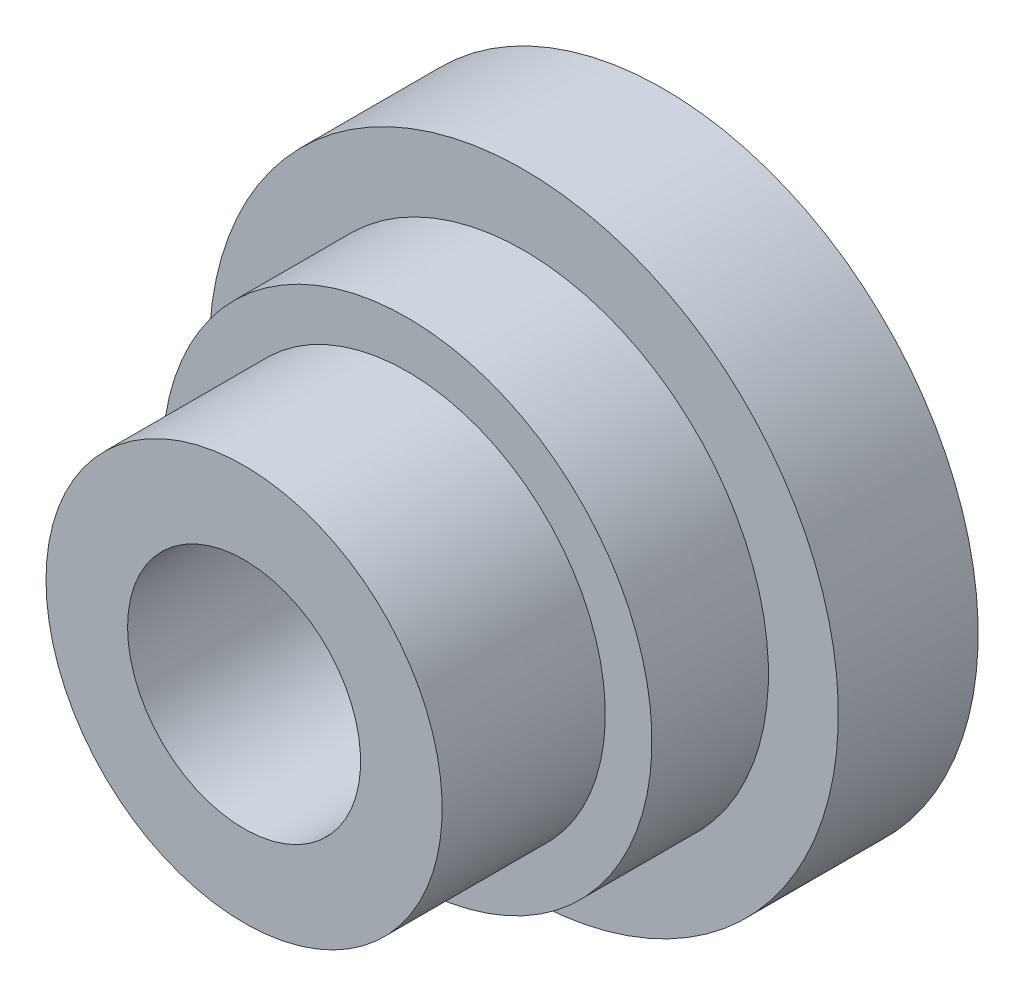
ISO-10303-21;
HEADER;
FILE_DESCRIPTION(('STEP AP214'),'2;1');
FILE_NAME('part.step','',(''),(''),'','','');
FILE_SCHEMA(('AUTOMOTIVE_DESIGN { 1 0 10303 214 1 1 1 1 }'));
ENDSEC;
DATA;
#1=APPLICATION_CONTEXT('core data for automotive mechanical design processes');
#2=APPLICATION_PROTOCOL_DEFINITION('international standard','automotive_design',2000,#1);
#3=PRODUCT_CONTEXT('',#1,'mechanical');
#4=PRODUCT('Part','Part','',(#3));
#5=PRODUCT_RELATED_PRODUCT_CATEGORY('part','',(#4));
#6=PRODUCT_DEFINITION_FORMATION('','',#4);
#7=PRODUCT_DEFINITION_CONTEXT('part definition',#1,'design');
#8=PRODUCT_DEFINITION('design','',#6,#7);
#9=PRODUCT_DEFINITION_SHAPE('','',#8);
#10=(LENGTH_UNIT() NAMED_UNIT(*) SI_UNIT(.MILLI.,.METRE.));
#11=(NAMED_UNIT(*) PLANE_ANGLE_UNIT() SI_UNIT($,.RADIAN.));
#12=(NAMED_UNIT(*) SI_UNIT($,.STERADIAN.) SOLID_ANGLE_UNIT());
#13=UNCERTAINTY_MEASURE_WITH_UNIT(LENGTH_MEASURE(1.E-05),#10,'distance_accuracy_value','');
#14=(GEOMETRIC_REPRESENTATION_CONTEXT(3) GLOBAL_UNCERTAINTY_ASSIGNED_CONTEXT((#13)) GLOBAL_UNIT_ASSIGNED_CONTEXT((#10,
#11,#12)) REPRESENTATION_CONTEXT('',''));
#15=CARTESIAN_POINT('',(0.,0.,0.));
#16=DIRECTION('',(0.,0.,1.));
#17=DIRECTION('',(1.,0.,0.));
#18=AXIS2_PLACEMENT_3D('',#15,#16,#17);
#19=CARTESIAN_POINT('',(0.,0.,0.));
#20=DIRECTION('',(0.,0.,-1.));
#21=DIRECTION('',(-1.,0.,0.));
#22=AXIS2_PLACEMENT_3D('',#19,#20,#21);
#23=CYLINDRICAL_SURFACE('',#22,27.);
#24=CARTESIAN_POINT('',(0.,0.,12.));
#25=DIRECTION('',(0.,0.,-1.));
#26=DIRECTION('',(-1.,0.,0.));
#27=AXIS2_PLACEMENT_3D('',#24,#25,#26);
#28=CIRCLE('',#27,27.);
#29=CARTESIAN_POINT('',(-27.,0.,12.));
#30=VERTEX_POINT('',#29);
#31=EDGE_CURVE('E10',#30,#30,#28,.T.);
#32=ORIENTED_EDGE('',*,*,#31,.T.);
#33=EDGE_LOOP('',(#32));
#34=FACE_BOUND('',#33,.T.);
#35=CARTESIAN_POINT('',(0.,0.,0.));
#36=DIRECTION('',(0.,0.,-1.));
#37=DIRECTION('',(-1.,0.,0.));
#38=AXIS2_PLACEMENT_3D('',#35,#36,#37);
#39=CIRCLE('',#38,27.);
#40=CARTESIAN_POINT('',(-27.,0.,0.));
#41=VERTEX_POINT('',#40);
#42=EDGE_CURVE('E56',#41,#41,#39,.T.);
#43=ORIENTED_EDGE('',*,*,#42,.F.);
#44=EDGE_LOOP('',(#43));
#45=FACE_BOUND('',#44,.T.);
#46=ADVANCED_FACE('F28',(#34,#45),#23,.T.);
#47=CARTESIAN_POINT('',(0.,27.,12.));
#48=DIRECTION('',(0.,0.,1.));
#49=DIRECTION('',(1.,0.,0.));
#50=AXIS2_PLACEMENT_3D('',#47,#48,#49);
#51=PLANE('',#50);
#52=CARTESIAN_POINT('',(0.,0.,12.));
#53=DIRECTION('',(0.,0.,-1.));
#54=DIRECTION('',(-1.,0.,0.));
#55=AXIS2_PLACEMENT_3D('',#52,#53,#54);
#56=CIRCLE('',#55,21.);
#57=CARTESIAN_POINT('',(-21.,0.,12.));
#58=VERTEX_POINT('',#57);
#59=EDGE_CURVE('E34',#58,#58,#56,.T.);
#60=ORIENTED_EDGE('',*,*,#59,.T.);
#61=EDGE_LOOP('',(#60));
#62=FACE_BOUND('',#61,.T.);
#63=ORIENTED_EDGE('',*,*,#31,.F.);
#64=EDGE_LOOP('',(#63));
#65=FACE_BOUND('',#64,.T.);
#66=ADVANCED_FACE('F64',(#62,#65),#51,.T.);
#67=CARTESIAN_POINT('',(0.,0.,0.));
#68=DIRECTION('',(0.,0.,-1.));
#69=DIRECTION('',(-1.,0.,0.));
#70=AXIS2_PLACEMENT_3D('',#67,#68,#69);
#71=CYLINDRICAL_SURFACE('',#70,21.);
#72=CARTESIAN_POINT('',(0.,0.,22.));
#73=DIRECTION('',(0.,0.,-1.));
#74=DIRECTION('',(-1.,0.,0.));
#75=AXIS2_PLACEMENT_3D('',#72,#73,#74);
#76=CIRCLE('',#75,21.);
#77=CARTESIAN_POINT('',(-21.,0.,22.));
#78=VERTEX_POINT('',#77);
#79=EDGE_CURVE('E38',#78,#78,#76,.T.);
#80=ORIENTED_EDGE('',*,*,#79,.T.);
#81=EDGE_LOOP('',(#80));
#82=FACE_BOUND('',#81,.T.);
#83=ORIENTED_EDGE('',*,*,#59,.F.);
#84=EDGE_LOOP('',(#83));
#85=FACE_BOUND('',#84,.T.);
#86=ADVANCED_FACE('F68',(#82,#85),#71,.T.);
#87=CARTESIAN_POINT('',(0.,21.,22.));
#88=DIRECTION('',(0.,0.,1.));
#89=DIRECTION('',(1.,0.,0.));
#90=AXIS2_PLACEMENT_3D('',#87,#88,#89);
#91=PLANE('',#90);
#92=CARTESIAN_POINT('',(0.,0.,22.));
#93=DIRECTION('',(0.,0.,-1.));
#94=DIRECTION('',(-1.,0.,0.));
#95=AXIS2_PLACEMENT_3D('',#92,#93,#94);
#96=CIRCLE('',#95,17.);
#97=CARTESIAN_POINT('',(-17.,0.,22.));
#98=VERTEX_POINT('',#97);
#99=EDGE_CURVE('E42',#98,#98,#96,.T.);
#100=ORIENTED_EDGE('',*,*,#99,.T.);
#101=EDGE_LOOP('',(#100));
#102=FACE_BOUND('',#101,.T.);
#103=ORIENTED_EDGE('',*,*,#79,.F.);
#104=EDGE_LOOP('',(#103));
#105=FACE_BOUND('',#104,.T.);
#106=ADVANCED_FACE('F72',(#102,#105),#91,.T.);
#107=CARTESIAN_POINT('',(0.,0.,0.));
#108=DIRECTION('',(0.,0.,-1.));
#109=DIRECTION('',(-1.,0.,0.));
#110=AXIS2_PLACEMENT_3D('',#107,#108,#109);
#111=CYLINDRICAL_SURFACE('',#110,17.);
#112=CARTESIAN_POINT('',(0.,0.,36.));
#113=DIRECTION('',(0.,0.,-1.));
#114=DIRECTION('',(-1.,0.,0.));
#115=AXIS2_PLACEMENT_3D('',#112,#113,#114);
#116=CIRCLE('',#115,17.);
#117=CARTESIAN_POINT('',(-17.,0.,36.));
#118=VERTEX_POINT('',#117);
#119=EDGE_CURVE('E47',#118,#118,#116,.T.);
#120=ORIENTED_EDGE('',*,*,#119,.T.);
#121=EDGE_LOOP('',(#120));
#122=FACE_BOUND('',#121,.T.);
#123=ORIENTED_EDGE('',*,*,#99,.F.);
#124=EDGE_LOOP('',(#123));
#125=FACE_BOUND('',#124,.T.);
#126=ADVANCED_FACE('F79',(#122,#125),#111,.T.);
#127=CARTESIAN_POINT('',(0.,17.,36.));
#128=DIRECTION('',(0.,0.,1.));
#129=DIRECTION('',(1.,0.,0.));
#130=AXIS2_PLACEMENT_3D('',#127,#128,#129);
#131=PLANE('',#130);
#132=CARTESIAN_POINT('',(0.,0.,36.));
#133=DIRECTION('',(0.,0.,-1.));
#134=DIRECTION('',(-1.,0.,0.));
#135=AXIS2_PLACEMENT_3D('',#132,#133,#134);
#136=CIRCLE('',#135,9.99999999999999);
#137=CARTESIAN_POINT('',(-9.99999999999999,0.,36.));
#138=VERTEX_POINT('',#137);
#139=EDGE_CURVE('E50',#138,#138,#136,.T.);
#140=ORIENTED_EDGE('',*,*,#139,.T.);
#141=EDGE_LOOP('',(#140));
#142=FACE_BOUND('',#141,.T.);
#143=ORIENTED_EDGE('',*,*,#119,.F.);
#144=EDGE_LOOP('',(#143));
#145=FACE_BOUND('',#144,.T.);
#146=ADVANCED_FACE('F83',(#142,#145),#131,.T.);
#147=CARTESIAN_POINT('',(0.,0.,0.));
#148=DIRECTION('',(0.,0.,-1.));
#149=DIRECTION('',(-1.,0.,0.));
#150=AXIS2_PLACEMENT_3D('',#147,#148,#149);
#151=CYLINDRICAL_SURFACE('',#150,9.99999999999999);
#152=CARTESIAN_POINT('',(0.,0.,0.));
#153=DIRECTION('',(0.,0.,-1.));
#154=DIRECTION('',(-1.,0.,0.));
#155=AXIS2_PLACEMENT_3D('',#152,#153,#154);
#156=CIRCLE('',#155,9.99999999999999);
#157=CARTESIAN_POINT('',(-9.99999999999999,0.,0.));
#158=VERTEX_POINT('',#157);
#159=EDGE_CURVE('E53',#158,#158,#156,.T.);
#160=ORIENTED_EDGE('',*,*,#159,.T.);
#161=EDGE_LOOP('',(#160));
#162=FACE_BOUND('',#161,.T.);
#163=ORIENTED_EDGE('',*,*,#139,.F.);
#164=EDGE_LOOP('',(#163));
#165=FACE_BOUND('',#164,.T.);
#166=ADVANCED_FACE('F87',(#162,#165),#151,.F.);
#167=CARTESIAN_POINT('',(0.,9.99999999999999,0.));
#168=DIRECTION('',(0.,0.,-1.));
#169=DIRECTION('',(-1.,0.,0.));
#170=AXIS2_PLACEMENT_3D('',#167,#168,#169);
#171=PLANE('',#170);
#172=ORIENTED_EDGE('',*,*,#42,.T.);
#173=EDGE_LOOP('',(#172));
#174=FACE_BOUND('',#173,.T.);
#175=ORIENTED_EDGE('',*,*,#159,.F.);
#176=EDGE_LOOP('',(#175));
#177=FACE_BOUND('',#176,.T.);
#178=ADVANCED_FACE('F60',(#174,#177),#171,.T.);
#179=CLOSED_SHELL('',(#46,#66,#86,#106,#126,#146,#166,#178));
#180=MANIFOLD_SOLID_BREP('B2',#179);
#181=ADVANCED_BREP_SHAPE_REPRESENTATION('',(#18,#180),#14);
#182=SHAPE_DEFINITION_REPRESENTATION(#9,#181);
ENDSEC;
END-ISO-10303-21;
